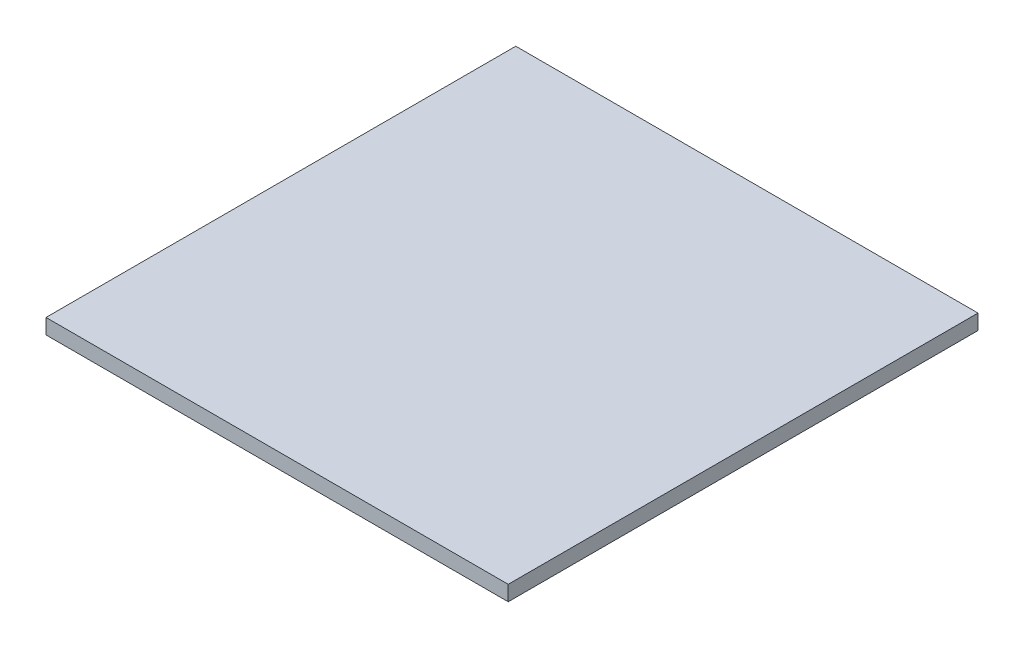
ISO-10303-21;
HEADER;
FILE_DESCRIPTION(('STEP AP214'),'2;1');
FILE_NAME('part.step','',(''),(''),'','','');
FILE_SCHEMA(('AUTOMOTIVE_DESIGN { 1 0 10303 214 1 1 1 1 }'));
ENDSEC;
DATA;
#1=APPLICATION_CONTEXT('core data for automotive mechanical design processes');
#2=APPLICATION_PROTOCOL_DEFINITION('international standard','automotive_design',2000,#1);
#3=PRODUCT_CONTEXT('',#1,'mechanical');
#4=PRODUCT('Part','Part','',(#3));
#5=PRODUCT_RELATED_PRODUCT_CATEGORY('part','',(#4));
#6=PRODUCT_DEFINITION_FORMATION('','',#4);
#7=PRODUCT_DEFINITION_CONTEXT('part definition',#1,'design');
#8=PRODUCT_DEFINITION('design','',#6,#7);
#9=PRODUCT_DEFINITION_SHAPE('','',#8);
#10=(LENGTH_UNIT() NAMED_UNIT(*) SI_UNIT(.MILLI.,.METRE.));
#11=(NAMED_UNIT(*) PLANE_ANGLE_UNIT() SI_UNIT($,.RADIAN.));
#12=(NAMED_UNIT(*) SI_UNIT($,.STERADIAN.) SOLID_ANGLE_UNIT());
#13=UNCERTAINTY_MEASURE_WITH_UNIT(LENGTH_MEASURE(1.E-05),#10,'distance_accuracy_value','');
#14=(GEOMETRIC_REPRESENTATION_CONTEXT(3) GLOBAL_UNCERTAINTY_ASSIGNED_CONTEXT((#13)) GLOBAL_UNIT_ASSIGNED_CONTEXT((#10,
#11,#12)) REPRESENTATION_CONTEXT('',''));
#15=CARTESIAN_POINT('',(0.,0.,0.));
#16=DIRECTION('',(0.,0.,1.));
#17=DIRECTION('',(1.,0.,0.));
#18=AXIS2_PLACEMENT_3D('',#15,#16,#17);
#19=CARTESIAN_POINT('',(152.5,10.,155.));
#20=DIRECTION('',(-1.,0.,0.));
#21=DIRECTION('',(0.,0.,1.));
#22=AXIS2_PLACEMENT_3D('',#19,#20,#21);
#23=PLANE('',#22);
#24=DIRECTION('',(0.,0.,-1.));
#25=VECTOR('',#24,1.);
#26=CARTESIAN_POINT('',(152.5,0.,155.));
#27=LINE('',#26,#25);
#28=CARTESIAN_POINT('',(152.5,0.,155.));
#29=VERTEX_POINT('',#28);
#30=CARTESIAN_POINT('',(152.5,0.,-155.));
#31=VERTEX_POINT('',#30);
#32=EDGE_CURVE('E96',#29,#31,#27,.T.);
#33=ORIENTED_EDGE('',*,*,#32,.T.);
#34=DIRECTION('',(0.,-1.,0.));
#35=VECTOR('',#34,1.);
#36=CARTESIAN_POINT('',(152.5,10.,-155.));
#37=LINE('',#36,#35);
#38=CARTESIAN_POINT('',(152.5,10.,-155.));
#39=VERTEX_POINT('',#38);
#40=EDGE_CURVE('E11',#39,#31,#37,.T.);
#41=ORIENTED_EDGE('',*,*,#40,.F.);
#42=DIRECTION('',(0.,0.,-1.));
#43=VECTOR('',#42,1.);
#44=CARTESIAN_POINT('',(152.5,10.,155.));
#45=LINE('',#44,#43);
#46=CARTESIAN_POINT('',(152.5,10.,155.));
#47=VERTEX_POINT('',#46);
#48=EDGE_CURVE('E84',#47,#39,#45,.T.);
#49=ORIENTED_EDGE('',*,*,#48,.F.);
#50=DIRECTION('',(0.,-1.,0.));
#51=VECTOR('',#50,1.);
#52=CARTESIAN_POINT('',(152.5,10.,155.));
#53=LINE('',#52,#51);
#54=EDGE_CURVE('E92',#47,#29,#53,.T.);
#55=ORIENTED_EDGE('',*,*,#54,.T.);
#56=EDGE_LOOP('',(#33,#41,#49,#55));
#57=FACE_BOUND('',#56,.T.);
#58=ADVANCED_FACE('F33',(#57),#23,.F.);
#59=CARTESIAN_POINT('',(-152.5,10.,-155.));
#60=DIRECTION('',(0.,0.,1.));
#61=DIRECTION('',(1.,0.,0.));
#62=AXIS2_PLACEMENT_3D('',#59,#60,#61);
#63=PLANE('',#62);
#64=DIRECTION('',(-1.,0.,0.));
#65=VECTOR('',#64,1.);
#66=CARTESIAN_POINT('',(-152.5,0.,-155.));
#67=LINE('',#66,#65);
#68=CARTESIAN_POINT('',(-152.5,0.,-155.));
#69=VERTEX_POINT('',#68);
#70=EDGE_CURVE('E88',#31,#69,#67,.T.);
#71=ORIENTED_EDGE('',*,*,#70,.T.);
#72=DIRECTION('',(0.,-1.,0.));
#73=VECTOR('',#72,1.);
#74=CARTESIAN_POINT('',(-152.5,10.,-155.));
#75=LINE('',#74,#73);
#76=CARTESIAN_POINT('',(-152.5,10.,-155.));
#77=VERTEX_POINT('',#76);
#78=EDGE_CURVE('E41',#77,#69,#75,.T.);
#79=ORIENTED_EDGE('',*,*,#78,.F.);
#80=DIRECTION('',(-1.,0.,0.));
#81=VECTOR('',#80,1.);
#82=CARTESIAN_POINT('',(-152.5,10.,-155.));
#83=LINE('',#82,#81);
#84=EDGE_CURVE('E79',#39,#77,#83,.T.);
#85=ORIENTED_EDGE('',*,*,#84,.F.);
#86=ORIENTED_EDGE('',*,*,#40,.T.);
#87=EDGE_LOOP('',(#71,#79,#85,#86));
#88=FACE_BOUND('',#87,.T.);
#89=ADVANCED_FACE('F87',(#88),#63,.F.);
#90=CARTESIAN_POINT('',(-152.5,10.,155.));
#91=DIRECTION('',(1.,0.,0.));
#92=DIRECTION('',(0.,0.,-1.));
#93=AXIS2_PLACEMENT_3D('',#90,#91,#92);
#94=PLANE('',#93);
#95=DIRECTION('',(0.,0.,1.));
#96=VECTOR('',#95,1.);
#97=CARTESIAN_POINT('',(-152.5,0.,155.));
#98=LINE('',#97,#96);
#99=CARTESIAN_POINT('',(-152.5,0.,155.));
#100=VERTEX_POINT('',#99);
#101=EDGE_CURVE('E66',#69,#100,#98,.T.);
#102=ORIENTED_EDGE('',*,*,#101,.T.);
#103=DIRECTION('',(0.,-1.,0.));
#104=VECTOR('',#103,1.);
#105=CARTESIAN_POINT('',(-152.5,10.,155.));
#106=LINE('',#105,#104);
#107=CARTESIAN_POINT('',(-152.5,10.,155.));
#108=VERTEX_POINT('',#107);
#109=EDGE_CURVE('E89',#108,#100,#106,.T.);
#110=ORIENTED_EDGE('',*,*,#109,.F.);
#111=DIRECTION('',(0.,0.,1.));
#112=VECTOR('',#111,1.);
#113=CARTESIAN_POINT('',(-152.5,10.,155.));
#114=LINE('',#113,#112);
#115=EDGE_CURVE('E82',#77,#108,#114,.T.);
#116=ORIENTED_EDGE('',*,*,#115,.F.);
#117=ORIENTED_EDGE('',*,*,#78,.T.);
#118=EDGE_LOOP('',(#102,#110,#116,#117));
#119=FACE_BOUND('',#118,.T.);
#120=ADVANCED_FACE('F90',(#119),#94,.F.);
#121=CARTESIAN_POINT('',(-152.5,10.,155.));
#122=DIRECTION('',(0.,0.,-1.));
#123=DIRECTION('',(-1.,0.,0.));
#124=AXIS2_PLACEMENT_3D('',#121,#122,#123);
#125=PLANE('',#124);
#126=DIRECTION('',(1.,0.,0.));
#127=VECTOR('',#126,1.);
#128=CARTESIAN_POINT('',(-152.5,0.,155.));
#129=LINE('',#128,#127);
#130=EDGE_CURVE('E72',#100,#29,#129,.T.);
#131=ORIENTED_EDGE('',*,*,#130,.T.);
#132=ORIENTED_EDGE('',*,*,#54,.F.);
#133=DIRECTION('',(1.,0.,0.));
#134=VECTOR('',#133,1.);
#135=CARTESIAN_POINT('',(-152.5,10.,155.));
#136=LINE('',#135,#134);
#137=EDGE_CURVE('E49',#108,#47,#136,.T.);
#138=ORIENTED_EDGE('',*,*,#137,.F.);
#139=ORIENTED_EDGE('',*,*,#109,.T.);
#140=EDGE_LOOP('',(#131,#132,#138,#139));
#141=FACE_BOUND('',#140,.T.);
#142=ADVANCED_FACE('F103',(#141),#125,.F.);
#143=CARTESIAN_POINT('',(0.,10.,0.));
#144=DIRECTION('',(0.,-1.,0.));
#145=DIRECTION('',(0.,0.,-1.));
#146=AXIS2_PLACEMENT_3D('',#143,#144,#145);
#147=PLANE('',#146);
#148=ORIENTED_EDGE('',*,*,#48,.T.);
#149=ORIENTED_EDGE('',*,*,#84,.T.);
#150=ORIENTED_EDGE('',*,*,#115,.T.);
#151=ORIENTED_EDGE('',*,*,#137,.T.);
#152=EDGE_LOOP('',(#148,#149,#150,#151));
#153=FACE_BOUND('',#152,.T.);
#154=ADVANCED_FACE('F80',(#153),#147,.F.);
#155=CARTESIAN_POINT('',(0.,0.,0.));
#156=DIRECTION('',(0.,-1.,0.));
#157=DIRECTION('',(0.,0.,-1.));
#158=AXIS2_PLACEMENT_3D('',#155,#156,#157);
#159=PLANE('',#158);
#160=ORIENTED_EDGE('',*,*,#32,.F.);
#161=ORIENTED_EDGE('',*,*,#130,.F.);
#162=ORIENTED_EDGE('',*,*,#101,.F.);
#163=ORIENTED_EDGE('',*,*,#70,.F.);
#164=EDGE_LOOP('',(#160,#161,#162,#163));
#165=FACE_BOUND('',#164,.T.);
#166=ADVANCED_FACE('F106',(#165),#159,.T.);
#167=CLOSED_SHELL('',(#58,#89,#120,#142,#154,#166));
#168=MANIFOLD_SOLID_BREP('B2',#167);
#169=ADVANCED_BREP_SHAPE_REPRESENTATION('',(#18,#168),#14);
#170=SHAPE_DEFINITION_REPRESENTATION(#9,#169);
ENDSEC;
END-ISO-10303-21;
